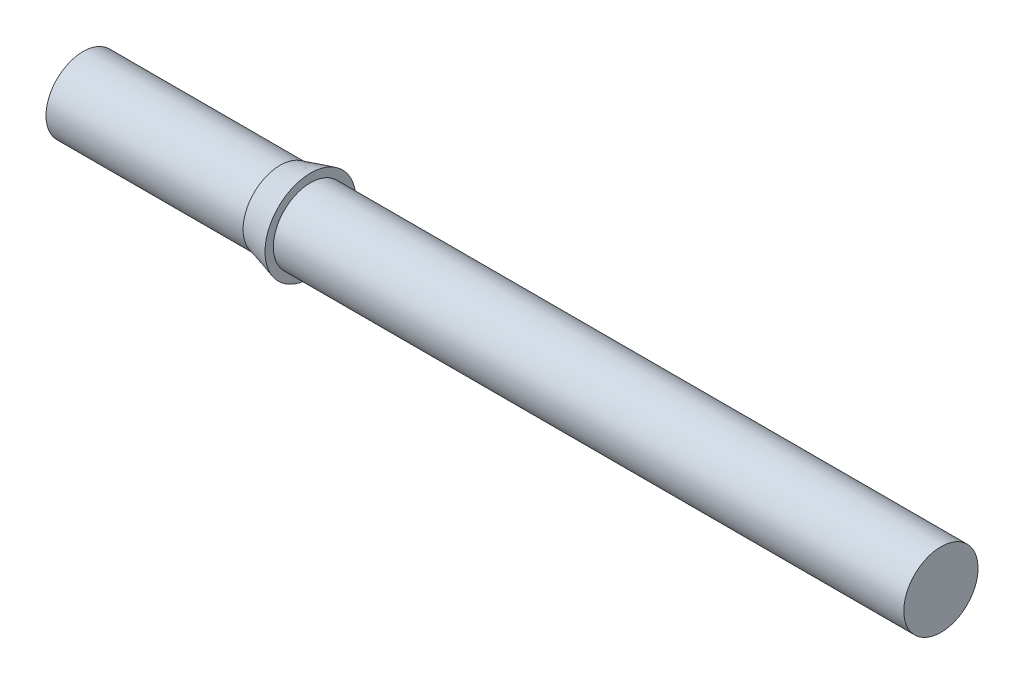
ISO-10303-21;
HEADER;
FILE_DESCRIPTION(('STEP AP214'),'2;1');
FILE_NAME('part.step','',(''),(''),'','','');
FILE_SCHEMA(('AUTOMOTIVE_DESIGN { 1 0 10303 214 1 1 1 1 }'));
ENDSEC;
DATA;
#1=APPLICATION_CONTEXT('core data for automotive mechanical design processes');
#2=APPLICATION_PROTOCOL_DEFINITION('international standard','automotive_design',2000,#1);
#3=PRODUCT_CONTEXT('',#1,'mechanical');
#4=PRODUCT('Part','Part','',(#3));
#5=PRODUCT_RELATED_PRODUCT_CATEGORY('part','',(#4));
#6=PRODUCT_DEFINITION_FORMATION('','',#4);
#7=PRODUCT_DEFINITION_CONTEXT('part definition',#1,'design');
#8=PRODUCT_DEFINITION('design','',#6,#7);
#9=PRODUCT_DEFINITION_SHAPE('','',#8);
#10=(LENGTH_UNIT() NAMED_UNIT(*) SI_UNIT(.MILLI.,.METRE.));
#11=(NAMED_UNIT(*) PLANE_ANGLE_UNIT() SI_UNIT($,.RADIAN.));
#12=(NAMED_UNIT(*) SI_UNIT($,.STERADIAN.) SOLID_ANGLE_UNIT());
#13=UNCERTAINTY_MEASURE_WITH_UNIT(LENGTH_MEASURE(1.E-05),#10,'distance_accuracy_value','');
#14=(GEOMETRIC_REPRESENTATION_CONTEXT(3) GLOBAL_UNCERTAINTY_ASSIGNED_CONTEXT((#13)) GLOBAL_UNIT_ASSIGNED_CONTEXT((#10,
#11,#12)) REPRESENTATION_CONTEXT('',''));
#15=CARTESIAN_POINT('',(0.,0.,0.));
#16=DIRECTION('',(0.,0.,1.));
#17=DIRECTION('',(1.,0.,0.));
#18=AXIS2_PLACEMENT_3D('',#15,#16,#17);
#19=CARTESIAN_POINT('',(10.5610535954417,-1.67142997233326,-1.87274860149955));
#20=DIRECTION('',(-1.,0.,0.));
#21=DIRECTION('',(0.,0.,1.));
#22=AXIS2_PLACEMENT_3D('',#19,#20,#21);
#23=CYLINDRICAL_SURFACE('',#22,2.45);
#24=CARTESIAN_POINT('',(3.63140713981352,-1.67142997233326,-1.87274860149955));
#25=DIRECTION('',(-1.,0.,0.));
#26=DIRECTION('',(0.,0.,1.));
#27=AXIS2_PLACEMENT_3D('',#24,#25,#26);
#28=CIRCLE('',#27,2.45);
#29=CARTESIAN_POINT('',(3.63140713981352,-1.67142997233326,0.577251398500449));
#30=VERTEX_POINT('',#29);
#31=EDGE_CURVE('E48',#30,#30,#28,.F.);
#32=ORIENTED_EDGE('',*,*,#31,.F.);
#33=EDGE_LOOP('',(#32));
#34=FACE_BOUND('',#33,.T.);
#35=CARTESIAN_POINT('',(-37.9685928601865,-1.67142997233326,-1.87274860149955));
#36=DIRECTION('',(-1.,0.,0.));
#37=DIRECTION('',(0.,0.,1.));
#38=AXIS2_PLACEMENT_3D('',#35,#36,#37);
#39=CIRCLE('',#38,2.45);
#40=CARTESIAN_POINT('',(-37.9685928601865,-1.67142997233326,0.577251398500449));
#41=VERTEX_POINT('',#40);
#42=EDGE_CURVE('E44',#41,#41,#39,.F.);
#43=ORIENTED_EDGE('',*,*,#42,.T.);
#44=EDGE_LOOP('',(#43));
#45=FACE_BOUND('',#44,.T.);
#46=ADVANCED_FACE('F39',(#34,#45),#23,.T.);
#47=CARTESIAN_POINT('',(3.63140713981352,-1.67142997233326,-1.87274860149955));
#48=DIRECTION('',(-1.,0.,0.));
#49=DIRECTION('',(0.,0.,1.));
#50=AXIS2_PLACEMENT_3D('',#47,#48,#49);
#51=PLANE('',#50);
#52=ORIENTED_EDGE('',*,*,#31,.T.);
#53=EDGE_LOOP('',(#52));
#54=FACE_BOUND('',#53,.T.);
#55=ADVANCED_FACE('F85',(#54),#51,.F.);
#56=CARTESIAN_POINT('',(-37.9685928601865,-1.67142997233326,-1.87274860149955));
#57=DIRECTION('',(-1.,0.,0.));
#58=DIRECTION('',(0.,0.,1.));
#59=AXIS2_PLACEMENT_3D('',#56,#57,#58);
#60=PLANE('',#59);
#61=ORIENTED_EDGE('',*,*,#42,.F.);
#62=EDGE_LOOP('',(#61));
#63=FACE_BOUND('',#62,.T.);
#64=CARTESIAN_POINT('',(-37.9685928601865,-1.67142997233326,-1.87274860149955));
#65=DIRECTION('',(-1.,0.,0.));
#66=DIRECTION('',(0.,0.,1.));
#67=AXIS2_PLACEMENT_3D('',#64,#65,#66);
#68=CIRCLE('',#67,3.);
#69=CARTESIAN_POINT('',(-37.9685928601865,-1.67142997233326,1.12725139850045));
#70=VERTEX_POINT('',#69);
#71=EDGE_CURVE('E94',#70,#70,#68,.T.);
#72=ORIENTED_EDGE('',*,*,#71,.F.);
#73=EDGE_LOOP('',(#72));
#74=FACE_BOUND('',#73,.T.);
#75=ADVANCED_FACE('F80',(#63,#74),#60,.F.);
#76=CARTESIAN_POINT('',(-39.9685928601865,-1.67142997233326,-1.87274860149955));
#77=DIRECTION('',(1.,0.,0.));
#78=DIRECTION('',(0.,0.,-1.));
#79=AXIS2_PLACEMENT_3D('',#76,#77,#78);
#80=CONICAL_SURFACE('',#79,2.45,0.268366210905906);
#81=ORIENTED_EDGE('',*,*,#71,.T.);
#82=EDGE_LOOP('',(#81));
#83=FACE_BOUND('',#82,.T.);
#84=CARTESIAN_POINT('',(-39.9685928601865,-1.67142997233326,-1.87274860149955));
#85=DIRECTION('',(1.,0.,0.));
#86=DIRECTION('',(0.,0.,-1.));
#87=AXIS2_PLACEMENT_3D('',#84,#85,#86);
#88=CIRCLE('',#87,2.45);
#89=CARTESIAN_POINT('',(-39.9685928601865,-1.67142997233326,-4.32274860149955));
#90=VERTEX_POINT('',#89);
#91=EDGE_CURVE('E11',#90,#90,#88,.T.);
#92=ORIENTED_EDGE('',*,*,#91,.T.);
#93=EDGE_LOOP('',(#92));
#94=FACE_BOUND('',#93,.T.);
#95=ADVANCED_FACE('F75',(#83,#94),#80,.T.);
#96=CARTESIAN_POINT('',(-52.9685928601865,-1.67142997233326,-1.87274860149955));
#97=DIRECTION('',(-1.,0.,0.));
#98=DIRECTION('',(0.,0.,1.));
#99=AXIS2_PLACEMENT_3D('',#96,#97,#98);
#100=PLANE('',#99);
#101=CARTESIAN_POINT('',(-52.9685928601865,-1.67142997233326,-1.87274860149955));
#102=DIRECTION('',(-1.,0.,0.));
#103=DIRECTION('',(0.,0.,1.));
#104=AXIS2_PLACEMENT_3D('',#101,#102,#103);
#105=CIRCLE('',#104,2.45);
#106=CARTESIAN_POINT('',(-52.9685928601865,-1.67142997233326,0.577251398500449));
#107=VERTEX_POINT('',#106);
#108=EDGE_CURVE('E53',#107,#107,#105,.T.);
#109=ORIENTED_EDGE('',*,*,#108,.T.);
#110=EDGE_LOOP('',(#109));
#111=FACE_BOUND('',#110,.T.);
#112=ADVANCED_FACE('F71',(#111),#100,.T.);
#113=ORIENTED_EDGE('',*,*,#91,.F.);
#114=EDGE_LOOP('',(#113));
#115=FACE_BOUND('',#114,.T.);
#116=ORIENTED_EDGE('',*,*,#108,.F.);
#117=EDGE_LOOP('',(#116));
#118=FACE_BOUND('',#117,.T.);
#119=ADVANCED_FACE('F41',(#115,#118),#23,.T.);
#120=CLOSED_SHELL('',(#46,#55,#75,#95,#112,#119));
#121=MANIFOLD_SOLID_BREP('B2',#120);
#122=ADVANCED_BREP_SHAPE_REPRESENTATION('',(#18,#121),#14);
#123=SHAPE_DEFINITION_REPRESENTATION(#9,#122);
ENDSEC;
END-ISO-10303-21;
